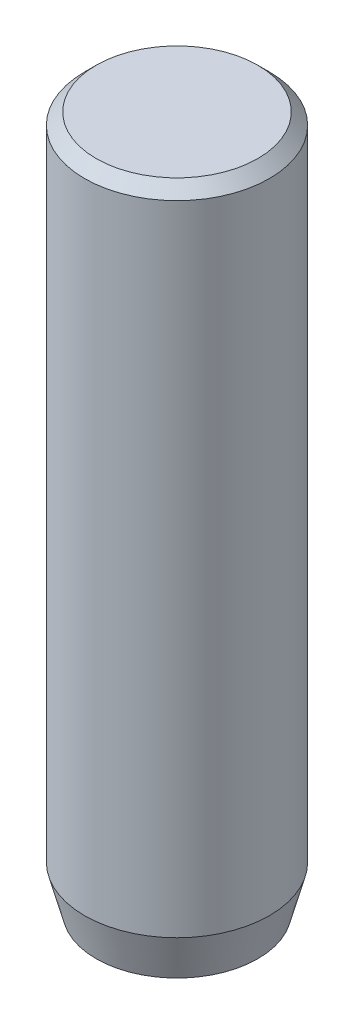
ISO-10303-21;
HEADER;
FILE_DESCRIPTION(('STEP AP214'),'2;1');
FILE_NAME('part.step','',(''),(''),'','','');
FILE_SCHEMA(('AUTOMOTIVE_DESIGN { 1 0 10303 214 1 1 1 1 }'));
ENDSEC;
DATA;
#1=APPLICATION_CONTEXT('core data for automotive mechanical design processes');
#2=APPLICATION_PROTOCOL_DEFINITION('international standard','automotive_design',2000,#1);
#3=PRODUCT_CONTEXT('',#1,'mechanical');
#4=PRODUCT('Part','Part','',(#3));
#5=PRODUCT_RELATED_PRODUCT_CATEGORY('part','',(#4));
#6=PRODUCT_DEFINITION_FORMATION('','',#4);
#7=PRODUCT_DEFINITION_CONTEXT('part definition',#1,'design');
#8=PRODUCT_DEFINITION('design','',#6,#7);
#9=PRODUCT_DEFINITION_SHAPE('','',#8);
#10=(LENGTH_UNIT() NAMED_UNIT(*) SI_UNIT(.MILLI.,.METRE.));
#11=(NAMED_UNIT(*) PLANE_ANGLE_UNIT() SI_UNIT($,.RADIAN.));
#12=(NAMED_UNIT(*) SI_UNIT($,.STERADIAN.) SOLID_ANGLE_UNIT());
#13=UNCERTAINTY_MEASURE_WITH_UNIT(LENGTH_MEASURE(1.E-05),#10,'distance_accuracy_value','');
#14=(GEOMETRIC_REPRESENTATION_CONTEXT(3) GLOBAL_UNCERTAINTY_ASSIGNED_CONTEXT((#13)) GLOBAL_UNIT_ASSIGNED_CONTEXT((#10,
#11,#12)) REPRESENTATION_CONTEXT('',''));
#15=CARTESIAN_POINT('',(0.,0.,0.));
#16=DIRECTION('',(0.,0.,1.));
#17=DIRECTION('',(1.,0.,0.));
#18=AXIS2_PLACEMENT_3D('',#15,#16,#17);
#19=CARTESIAN_POINT('',(0.,15.,0.));
#20=DIRECTION('',(0.,-1.,0.));
#21=DIRECTION('',(0.,0.,-1.));
#22=AXIS2_PLACEMENT_3D('',#19,#20,#21);
#23=CYLINDRICAL_SURFACE('',#22,4.);
#24=CARTESIAN_POINT('',(0.,-13.1339745962156,0.));
#25=DIRECTION('',(0.,1.,0.));
#26=DIRECTION('',(0.,0.,1.));
#27=AXIS2_PLACEMENT_3D('',#24,#25,#26);
#28=CIRCLE('',#27,4.);
#29=CARTESIAN_POINT('',(0.,-13.1339745962156,4.));
#30=VERTEX_POINT('',#29);
#31=EDGE_CURVE('E37',#30,#30,#28,.T.);
#32=ORIENTED_EDGE('',*,*,#31,.T.);
#33=EDGE_LOOP('',(#32));
#34=FACE_BOUND('',#33,.T.);
#35=CARTESIAN_POINT('',(0.,14.5,0.));
#36=DIRECTION('',(0.,1.,0.));
#37=DIRECTION('',(0.,0.,1.));
#38=AXIS2_PLACEMENT_3D('',#35,#36,#37);
#39=CIRCLE('',#38,4.);
#40=CARTESIAN_POINT('',(0.,14.5,4.));
#41=VERTEX_POINT('',#40);
#42=EDGE_CURVE('E41',#41,#41,#39,.F.);
#43=ORIENTED_EDGE('',*,*,#42,.T.);
#44=EDGE_LOOP('',(#43));
#45=FACE_BOUND('',#44,.T.);
#46=ADVANCED_FACE('F30',(#34,#45),#23,.T.);
#47=CARTESIAN_POINT('',(0.,15.,0.));
#48=DIRECTION('',(0.,1.,0.));
#49=DIRECTION('',(0.,0.,1.));
#50=AXIS2_PLACEMENT_3D('',#47,#48,#49);
#51=PLANE('',#50);
#52=CARTESIAN_POINT('',(0.,15.,0.));
#53=DIRECTION('',(0.,1.,0.));
#54=DIRECTION('',(0.,0.,1.));
#55=AXIS2_PLACEMENT_3D('',#52,#53,#54);
#56=CIRCLE('',#55,3.50000000000001);
#57=CARTESIAN_POINT('',(0.,15.,3.50000000000001));
#58=VERTEX_POINT('',#57);
#59=EDGE_CURVE('E45',#58,#58,#56,.T.);
#60=ORIENTED_EDGE('',*,*,#59,.T.);
#61=EDGE_LOOP('',(#60));
#62=FACE_BOUND('',#61,.T.);
#63=ADVANCED_FACE('F51',(#62),#51,.T.);
#64=CARTESIAN_POINT('',(0.,-15.,0.));
#65=DIRECTION('',(0.,1.,0.));
#66=DIRECTION('',(0.,0.,1.));
#67=AXIS2_PLACEMENT_3D('',#64,#65,#66);
#68=PLANE('',#67);
#69=CARTESIAN_POINT('',(0.,-15.,0.));
#70=DIRECTION('',(0.,1.,0.));
#71=DIRECTION('',(0.,0.,1.));
#72=AXIS2_PLACEMENT_3D('',#69,#70,#71);
#73=CIRCLE('',#72,3.50000000000001);
#74=CARTESIAN_POINT('',(0.,-15.,3.50000000000001));
#75=VERTEX_POINT('',#74);
#76=EDGE_CURVE('E10',#75,#75,#73,.F.);
#77=ORIENTED_EDGE('',*,*,#76,.T.);
#78=EDGE_LOOP('',(#77));
#79=FACE_BOUND('',#78,.T.);
#80=ADVANCED_FACE('F55',(#79),#68,.F.);
#81=CARTESIAN_POINT('',(0.,15.,0.));
#82=DIRECTION('',(0.,-1.,0.));
#83=DIRECTION('',(0.,0.,-1.));
#84=AXIS2_PLACEMENT_3D('',#81,#82,#83);
#85=CONICAL_SURFACE('',#84,3.50000000000001,0.785398163397445);
#86=ORIENTED_EDGE('',*,*,#42,.F.);
#87=EDGE_LOOP('',(#86));
#88=FACE_BOUND('',#87,.T.);
#89=ORIENTED_EDGE('',*,*,#59,.F.);
#90=EDGE_LOOP('',(#89));
#91=FACE_BOUND('',#90,.T.);
#92=ADVANCED_FACE('F53',(#88,#91),#85,.T.);
#93=CARTESIAN_POINT('',(0.,-13.1339745962156,0.));
#94=DIRECTION('',(0.,1.,0.));
#95=DIRECTION('',(0.,0.,1.));
#96=AXIS2_PLACEMENT_3D('',#93,#94,#95);
#97=CONICAL_SURFACE('',#96,4.,0.26179938779915);
#98=ORIENTED_EDGE('',*,*,#76,.F.);
#99=EDGE_LOOP('',(#98));
#100=FACE_BOUND('',#99,.T.);
#101=ORIENTED_EDGE('',*,*,#31,.F.);
#102=EDGE_LOOP('',(#101));
#103=FACE_BOUND('',#102,.T.);
#104=ADVANCED_FACE('F32',(#100,#103),#97,.T.);
#105=CLOSED_SHELL('',(#46,#63,#80,#92,#104));
#106=MANIFOLD_SOLID_BREP('B2',#105);
#107=ADVANCED_BREP_SHAPE_REPRESENTATION('',(#18,#106),#14);
#108=SHAPE_DEFINITION_REPRESENTATION(#9,#107);
ENDSEC;
END-ISO-10303-21;
